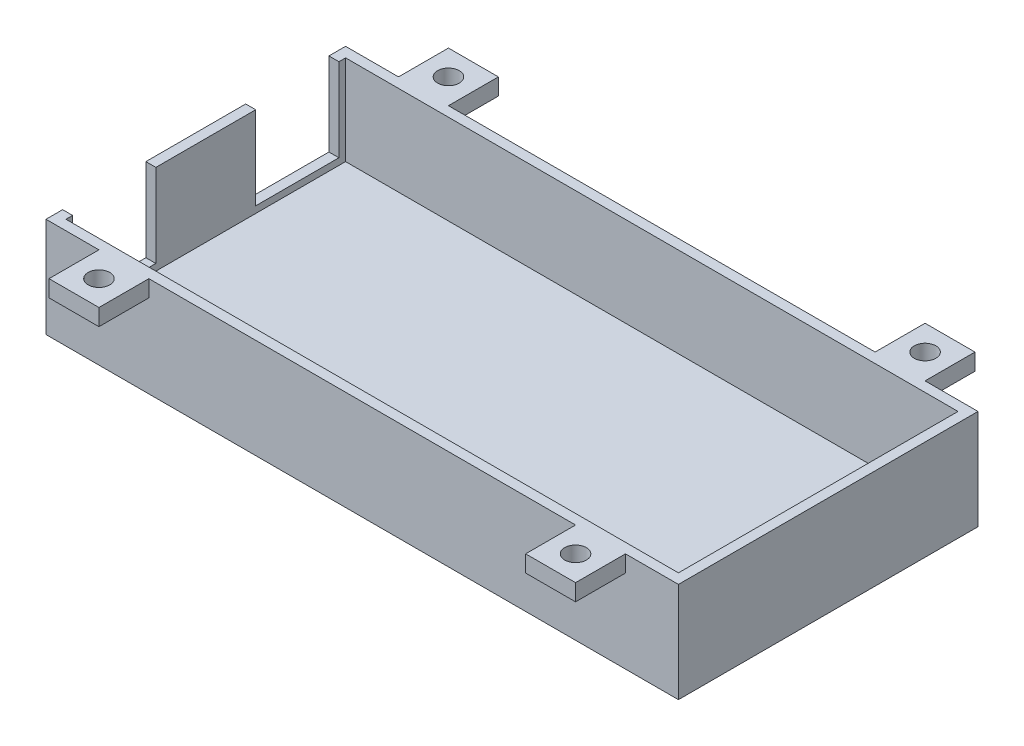
ISO-10303-21;
HEADER;
FILE_DESCRIPTION(('STEP AP214'),'2;1');
FILE_NAME('part.step','',(''),(''),'','','');
FILE_SCHEMA(('AUTOMOTIVE_DESIGN { 1 0 10303 214 1 1 1 1 }'));
ENDSEC;
DATA;
#1=APPLICATION_CONTEXT('core data for automotive mechanical design processes');
#2=APPLICATION_PROTOCOL_DEFINITION('international standard','automotive_design',2000,#1);
#3=PRODUCT_CONTEXT('',#1,'mechanical');
#4=PRODUCT('Part','Part','',(#3));
#5=PRODUCT_RELATED_PRODUCT_CATEGORY('part','',(#4));
#6=PRODUCT_DEFINITION_FORMATION('','',#4);
#7=PRODUCT_DEFINITION_CONTEXT('part definition',#1,'design');
#8=PRODUCT_DEFINITION('design','',#6,#7);
#9=PRODUCT_DEFINITION_SHAPE('','',#8);
#10=(LENGTH_UNIT() NAMED_UNIT(*) SI_UNIT(.MILLI.,.METRE.));
#11=(NAMED_UNIT(*) PLANE_ANGLE_UNIT() SI_UNIT($,.RADIAN.));
#12=(NAMED_UNIT(*) SI_UNIT($,.STERADIAN.) SOLID_ANGLE_UNIT());
#13=UNCERTAINTY_MEASURE_WITH_UNIT(LENGTH_MEASURE(1.E-05),#10,'distance_accuracy_value','');
#14=(GEOMETRIC_REPRESENTATION_CONTEXT(3) GLOBAL_UNCERTAINTY_ASSIGNED_CONTEXT((#13)) GLOBAL_UNIT_ASSIGNED_CONTEXT((#10,
#11,#12)) REPRESENTATION_CONTEXT('',''));
#15=CARTESIAN_POINT('',(0.,0.,0.));
#16=DIRECTION('',(0.,0.,1.));
#17=DIRECTION('',(1.,0.,0.));
#18=AXIS2_PLACEMENT_3D('',#15,#16,#17);
#19=CARTESIAN_POINT('',(0.,30.,0.));
#20=DIRECTION('',(0.,1.,0.));
#21=DIRECTION('',(0.,0.,1.));
#22=AXIS2_PLACEMENT_3D('',#19,#20,#21);
#23=PLANE('',#22);
#24=CARTESIAN_POINT('',(-71.5935450431154,30.,-52.5));
#25=DIRECTION('',(0.,1.,0.));
#26=DIRECTION('',(0.,0.,1.));
#27=AXIS2_PLACEMENT_3D('',#24,#25,#26);
#28=CIRCLE('',#27,3.25000000000001);
#29=CARTESIAN_POINT('',(-71.5935450431154,30.,-49.25));
#30=VERTEX_POINT('',#29);
#31=EDGE_CURVE('E393',#30,#30,#28,.T.);
#32=ORIENTED_EDGE('',*,*,#31,.F.);
#33=EDGE_LOOP('',(#32));
#34=FACE_BOUND('',#33,.T.);
#35=CARTESIAN_POINT('',(-71.5935450431154,30.,52.5));
#36=DIRECTION('',(0.,1.,0.));
#37=DIRECTION('',(0.,0.,-1.));
#38=AXIS2_PLACEMENT_3D('',#35,#36,#37);
#39=CIRCLE('',#38,3.25000000000001);
#40=CARTESIAN_POINT('',(-71.5935450431154,30.,49.25));
#41=VERTEX_POINT('',#40);
#42=EDGE_CURVE('E357',#41,#41,#39,.T.);
#43=ORIENTED_EDGE('',*,*,#42,.F.);
#44=EDGE_LOOP('',(#43));
#45=FACE_BOUND('',#44,.T.);
#46=CARTESIAN_POINT('',(71.5935450431154,30.,52.5));
#47=DIRECTION('',(0.,1.,0.));
#48=DIRECTION('',(0.,0.,1.));
#49=AXIS2_PLACEMENT_3D('',#46,#47,#48);
#50=CIRCLE('',#49,3.25000000000001);
#51=CARTESIAN_POINT('',(71.5935450431154,30.,55.75));
#52=VERTEX_POINT('',#51);
#53=EDGE_CURVE('E322',#52,#52,#50,.T.);
#54=ORIENTED_EDGE('',*,*,#53,.F.);
#55=EDGE_LOOP('',(#54));
#56=FACE_BOUND('',#55,.T.);
#57=CARTESIAN_POINT('',(71.5935450431154,30.,-52.5));
#58=DIRECTION('',(0.,1.,0.));
#59=DIRECTION('',(0.,0.,-1.));
#60=AXIS2_PLACEMENT_3D('',#57,#58,#59);
#61=CIRCLE('',#60,3.25000000000001);
#62=CARTESIAN_POINT('',(71.5935450431154,30.,-55.75));
#63=VERTEX_POINT('',#62);
#64=EDGE_CURVE('E295',#63,#63,#61,.T.);
#65=ORIENTED_EDGE('',*,*,#64,.F.);
#66=EDGE_LOOP('',(#65));
#67=FACE_BOUND('',#66,.T.);
#68=DIRECTION('',(-1.,0.,0.));
#69=VECTOR('',#68,1.);
#70=CARTESIAN_POINT('',(92.,30.,42.));
#71=LINE('',#70,#69);
#72=CARTESIAN_POINT('',(92.,30.,42.));
#73=VERTEX_POINT('',#72);
#74=CARTESIAN_POINT('',(-92.,30.,42.));
#75=VERTEX_POINT('',#74);
#76=EDGE_CURVE('E265',#73,#75,#71,.T.);
#77=ORIENTED_EDGE('',*,*,#76,.T.);
#78=DIRECTION('',(0.,0.,-1.));
#79=VECTOR('',#78,1.);
#80=CARTESIAN_POINT('',(-92.,30.,42.));
#81=LINE('',#80,#79);
#82=CARTESIAN_POINT('',(-92.,30.,40.));
#83=VERTEX_POINT('',#82);
#84=EDGE_CURVE('E268',#75,#83,#81,.T.);
#85=ORIENTED_EDGE('',*,*,#84,.T.);
#86=DIRECTION('',(1.,0.,0.));
#87=VECTOR('',#86,1.);
#88=CARTESIAN_POINT('',(-90.,30.,40.));
#89=LINE('',#88,#87);
#90=CARTESIAN_POINT('',(-95.,30.,40.));
#91=VERTEX_POINT('',#90);
#92=EDGE_CURVE('E464',#91,#83,#89,.T.);
#93=ORIENTED_EDGE('',*,*,#92,.F.);
#94=DIRECTION('',(0.,0.,1.));
#95=VECTOR('',#94,1.);
#96=CARTESIAN_POINT('',(-95.,30.,-45.));
#97=LINE('',#96,#95);
#98=CARTESIAN_POINT('',(-95.,30.,45.));
#99=VERTEX_POINT('',#98);
#100=EDGE_CURVE('E478',#91,#99,#97,.T.);
#101=ORIENTED_EDGE('',*,*,#100,.T.);
#102=DIRECTION('',(1.,0.,0.));
#103=VECTOR('',#102,1.);
#104=CARTESIAN_POINT('',(-95.,30.,45.));
#105=LINE('',#104,#103);
#106=CARTESIAN_POINT('',(-79.0935450431154,30.,45.));
#107=VERTEX_POINT('',#106);
#108=EDGE_CURVE('E485',#99,#107,#105,.T.);
#109=ORIENTED_EDGE('',*,*,#108,.T.);
#110=DIRECTION('',(0.,0.,1.));
#111=VECTOR('',#110,1.);
#112=CARTESIAN_POINT('',(-79.0935450431154,30.,45.));
#113=LINE('',#112,#111);
#114=CARTESIAN_POINT('',(-79.0935450431154,30.,60.));
#115=VERTEX_POINT('',#114);
#116=EDGE_CURVE('E367',#107,#115,#113,.T.);
#117=ORIENTED_EDGE('',*,*,#116,.T.);
#118=DIRECTION('',(1.,0.,0.));
#119=VECTOR('',#118,1.);
#120=CARTESIAN_POINT('',(-79.0935450431154,30.,60.));
#121=LINE('',#120,#119);
#122=CARTESIAN_POINT('',(-64.0935450431154,30.,60.));
#123=VERTEX_POINT('',#122);
#124=EDGE_CURVE('E385',#115,#123,#121,.T.);
#125=ORIENTED_EDGE('',*,*,#124,.T.);
#126=DIRECTION('',(0.,0.,-1.));
#127=VECTOR('',#126,1.);
#128=CARTESIAN_POINT('',(-64.0935450431154,30.,45.));
#129=LINE('',#128,#127);
#130=CARTESIAN_POINT('',(-64.0935450431154,30.,45.));
#131=VERTEX_POINT('',#130);
#132=EDGE_CURVE('E374',#123,#131,#129,.T.);
#133=ORIENTED_EDGE('',*,*,#132,.T.);
#134=CARTESIAN_POINT('',(64.0935450431154,30.,45.));
#135=VERTEX_POINT('',#134);
#136=EDGE_CURVE('E489',#131,#135,#105,.T.);
#137=ORIENTED_EDGE('',*,*,#136,.T.);
#138=DIRECTION('',(0.,0.,1.));
#139=VECTOR('',#138,1.);
#140=CARTESIAN_POINT('',(64.0935450431154,30.,45.));
#141=LINE('',#140,#139);
#142=CARTESIAN_POINT('',(64.0935450431154,30.,60.));
#143=VERTEX_POINT('',#142);
#144=EDGE_CURVE('E331',#135,#143,#141,.T.);
#145=ORIENTED_EDGE('',*,*,#144,.T.);
#146=DIRECTION('',(1.,0.,0.));
#147=VECTOR('',#146,1.);
#148=CARTESIAN_POINT('',(79.0935450431154,30.,60.));
#149=LINE('',#148,#147);
#150=CARTESIAN_POINT('',(79.0935450431154,30.,60.));
#151=VERTEX_POINT('',#150);
#152=EDGE_CURVE('E350',#143,#151,#149,.T.);
#153=ORIENTED_EDGE('',*,*,#152,.T.);
#154=DIRECTION('',(0.,0.,-1.));
#155=VECTOR('',#154,1.);
#156=CARTESIAN_POINT('',(79.0935450431154,30.,45.));
#157=LINE('',#156,#155);
#158=CARTESIAN_POINT('',(79.0935450431154,30.,45.));
#159=VERTEX_POINT('',#158);
#160=EDGE_CURVE('E338',#151,#159,#157,.T.);
#161=ORIENTED_EDGE('',*,*,#160,.T.);
#162=CARTESIAN_POINT('',(95.,30.,45.));
#163=VERTEX_POINT('',#162);
#164=EDGE_CURVE('E483',#159,#163,#105,.T.);
#165=ORIENTED_EDGE('',*,*,#164,.T.);
#166=DIRECTION('',(0.,0.,-1.));
#167=VECTOR('',#166,1.);
#168=CARTESIAN_POINT('',(95.,30.,-45.));
#169=LINE('',#168,#167);
#170=CARTESIAN_POINT('',(95.,30.,-45.));
#171=VERTEX_POINT('',#170);
#172=EDGE_CURVE('E468',#163,#171,#169,.T.);
#173=ORIENTED_EDGE('',*,*,#172,.T.);
#174=DIRECTION('',(-1.,0.,0.));
#175=VECTOR('',#174,1.);
#176=CARTESIAN_POINT('',(-95.,30.,-45.));
#177=LINE('',#176,#175);
#178=CARTESIAN_POINT('',(79.0935450431154,30.,-45.));
#179=VERTEX_POINT('',#178);
#180=EDGE_CURVE('E475',#171,#179,#177,.T.);
#181=ORIENTED_EDGE('',*,*,#180,.T.);
#182=DIRECTION('',(0.,0.,-1.));
#183=VECTOR('',#182,1.);
#184=CARTESIAN_POINT('',(79.0935450431154,30.,-45.));
#185=LINE('',#184,#183);
#186=CARTESIAN_POINT('',(79.0935450431154,30.,-60.));
#187=VERTEX_POINT('',#186);
#188=EDGE_CURVE('E299',#179,#187,#185,.T.);
#189=ORIENTED_EDGE('',*,*,#188,.T.);
#190=DIRECTION('',(-1.,0.,0.));
#191=VECTOR('',#190,1.);
#192=CARTESIAN_POINT('',(79.0935450431154,30.,-60.));
#193=LINE('',#192,#191);
#194=CARTESIAN_POINT('',(64.0935450431154,30.,-60.));
#195=VERTEX_POINT('',#194);
#196=EDGE_CURVE('E316',#187,#195,#193,.T.);
#197=ORIENTED_EDGE('',*,*,#196,.T.);
#198=DIRECTION('',(0.,0.,1.));
#199=VECTOR('',#198,1.);
#200=CARTESIAN_POINT('',(64.0935450431154,30.,-45.));
#201=LINE('',#200,#199);
#202=CARTESIAN_POINT('',(64.0935450431154,30.,-45.));
#203=VERTEX_POINT('',#202);
#204=EDGE_CURVE('E55',#195,#203,#201,.T.);
#205=ORIENTED_EDGE('',*,*,#204,.T.);
#206=CARTESIAN_POINT('',(-64.0935450431154,30.,-45.));
#207=VERTEX_POINT('',#206);
#208=EDGE_CURVE('E479',#203,#207,#177,.T.);
#209=ORIENTED_EDGE('',*,*,#208,.T.);
#210=DIRECTION('',(0.,0.,-1.));
#211=VECTOR('',#210,1.);
#212=CARTESIAN_POINT('',(-64.0935450431154,30.,-45.));
#213=LINE('',#212,#211);
#214=CARTESIAN_POINT('',(-64.0935450431154,30.,-60.));
#215=VERTEX_POINT('',#214);
#216=EDGE_CURVE('E421',#207,#215,#213,.T.);
#217=ORIENTED_EDGE('',*,*,#216,.T.);
#218=DIRECTION('',(-1.,0.,0.));
#219=VECTOR('',#218,1.);
#220=CARTESIAN_POINT('',(-79.0935450431154,30.,-60.));
#221=LINE('',#220,#219);
#222=CARTESIAN_POINT('',(-79.0935450431154,30.,-60.));
#223=VERTEX_POINT('',#222);
#224=EDGE_CURVE('E409',#215,#223,#221,.T.);
#225=ORIENTED_EDGE('',*,*,#224,.T.);
#226=DIRECTION('',(0.,0.,1.));
#227=VECTOR('',#226,1.);
#228=CARTESIAN_POINT('',(-79.0935450431154,30.,-45.));
#229=LINE('',#228,#227);
#230=CARTESIAN_POINT('',(-79.0935450431154,30.,-45.));
#231=VERTEX_POINT('',#230);
#232=EDGE_CURVE('E402',#223,#231,#229,.T.);
#233=ORIENTED_EDGE('',*,*,#232,.T.);
#234=CARTESIAN_POINT('',(-95.,30.,-45.));
#235=VERTEX_POINT('',#234);
#236=EDGE_CURVE('E474',#231,#235,#177,.T.);
#237=ORIENTED_EDGE('',*,*,#236,.T.);
#238=CARTESIAN_POINT('',(-95.,30.,-40.));
#239=VERTEX_POINT('',#238);
#240=EDGE_CURVE('E480',#235,#239,#97,.T.);
#241=ORIENTED_EDGE('',*,*,#240,.T.);
#242=DIRECTION('',(-1.,0.,0.));
#243=VECTOR('',#242,1.);
#244=CARTESIAN_POINT('',(-90.,30.,-40.));
#245=LINE('',#244,#243);
#246=CARTESIAN_POINT('',(-92.,30.,-40.));
#247=VERTEX_POINT('',#246);
#248=EDGE_CURVE('E462',#247,#239,#245,.T.);
#249=ORIENTED_EDGE('',*,*,#248,.F.);
#250=CARTESIAN_POINT('',(-92.,30.,-42.));
#251=VERTEX_POINT('',#250);
#252=EDGE_CURVE('E276',#247,#251,#81,.T.);
#253=ORIENTED_EDGE('',*,*,#252,.T.);
#254=DIRECTION('',(-1.,0.,0.));
#255=VECTOR('',#254,1.);
#256=CARTESIAN_POINT('',(92.,30.,-42.));
#257=LINE('',#256,#255);
#258=CARTESIAN_POINT('',(92.,30.,-42.));
#259=VERTEX_POINT('',#258);
#260=EDGE_CURVE('E274',#259,#251,#257,.T.);
#261=ORIENTED_EDGE('',*,*,#260,.F.);
#262=DIRECTION('',(0.,0.,-1.));
#263=VECTOR('',#262,1.);
#264=CARTESIAN_POINT('',(92.,30.,42.));
#265=LINE('',#264,#263);
#266=EDGE_CURVE('E248',#73,#259,#265,.T.);
#267=ORIENTED_EDGE('',*,*,#266,.F.);
#268=EDGE_LOOP('',(#77,#85,#93,#101,#109,#117,#125,#133,#137,#145,#153,#161,#165,#173,#181,#189,
#197,#205,#209,#217,#225,#233,#237,#241,#249,#253,#261,#267));
#269=FACE_BOUND('',#268,.T.);
#270=ADVANCED_FACE('F33',(#34,#45,#56,#67,#269),#23,.T.);
#271=DIRECTION('',(1.,0.,0.));
#272=VECTOR('',#271,1.);
#273=CARTESIAN_POINT('',(-130.355339059327,30.,15.));
#274=LINE('',#273,#272);
#275=CARTESIAN_POINT('',(-95.,30.,15.));
#276=VERTEX_POINT('',#275);
#277=CARTESIAN_POINT('',(-92.,30.,15.));
#278=VERTEX_POINT('',#277);
#279=EDGE_CURVE('E454',#276,#278,#274,.T.);
#280=ORIENTED_EDGE('',*,*,#279,.T.);
#281=CARTESIAN_POINT('',(-92.,30.,-15.));
#282=VERTEX_POINT('',#281);
#283=EDGE_CURVE('E278',#278,#282,#81,.T.);
#284=ORIENTED_EDGE('',*,*,#283,.T.);
#285=DIRECTION('',(1.,0.,0.));
#286=VECTOR('',#285,1.);
#287=CARTESIAN_POINT('',(-130.355339059327,30.,-15.));
#288=LINE('',#287,#286);
#289=CARTESIAN_POINT('',(-95.,30.,-15.));
#290=VERTEX_POINT('',#289);
#291=EDGE_CURVE('E444',#290,#282,#288,.T.);
#292=ORIENTED_EDGE('',*,*,#291,.F.);
#293=EDGE_CURVE('E484',#290,#276,#97,.T.);
#294=ORIENTED_EDGE('',*,*,#293,.T.);
#295=EDGE_LOOP('',(#280,#284,#292,#294));
#296=FACE_BOUND('',#295,.T.);
#297=ADVANCED_FACE('F534',(#296),#23,.T.);
#298=CARTESIAN_POINT('',(-90.,30.,-40.));
#299=DIRECTION('',(0.,0.,1.));
#300=DIRECTION('',(1.,0.,0.));
#301=AXIS2_PLACEMENT_3D('',#298,#299,#300);
#302=PLANE('',#301);
#303=DIRECTION('',(-1.,0.,0.));
#304=VECTOR('',#303,1.);
#305=CARTESIAN_POINT('',(-90.,5.,-40.));
#306=LINE('',#305,#304);
#307=CARTESIAN_POINT('',(-92.,5.,-40.));
#308=VERTEX_POINT('',#307);
#309=CARTESIAN_POINT('',(-95.,5.,-40.));
#310=VERTEX_POINT('',#309);
#311=EDGE_CURVE('E449',#308,#310,#306,.T.);
#312=ORIENTED_EDGE('',*,*,#311,.F.);
#313=DIRECTION('',(0.,1.,0.));
#314=VECTOR('',#313,1.);
#315=CARTESIAN_POINT('',(-92.,30.,-40.));
#316=LINE('',#315,#314);
#317=EDGE_CURVE('E286',#308,#247,#316,.T.);
#318=ORIENTED_EDGE('',*,*,#317,.T.);
#319=ORIENTED_EDGE('',*,*,#248,.T.);
#320=DIRECTION('',(0.,-1.,0.));
#321=VECTOR('',#320,1.);
#322=CARTESIAN_POINT('',(-95.,5.,-40.));
#323=LINE('',#322,#321);
#324=EDGE_CURVE('E437',#239,#310,#323,.T.);
#325=ORIENTED_EDGE('',*,*,#324,.T.);
#326=EDGE_LOOP('',(#312,#318,#319,#325));
#327=FACE_BOUND('',#326,.T.);
#328=ADVANCED_FACE('F551',(#327),#302,.T.);
#329=CARTESIAN_POINT('',(-90.,30.,40.));
#330=DIRECTION('',(0.,0.,-1.));
#331=DIRECTION('',(-1.,0.,0.));
#332=AXIS2_PLACEMENT_3D('',#329,#330,#331);
#333=PLANE('',#332);
#334=ORIENTED_EDGE('',*,*,#92,.T.);
#335=DIRECTION('',(0.,-1.,0.));
#336=VECTOR('',#335,1.);
#337=CARTESIAN_POINT('',(-92.,30.,40.));
#338=LINE('',#337,#336);
#339=CARTESIAN_POINT('',(-92.,5.,40.));
#340=VERTEX_POINT('',#339);
#341=EDGE_CURVE('E292',#83,#340,#338,.T.);
#342=ORIENTED_EDGE('',*,*,#341,.T.);
#343=DIRECTION('',(1.,0.,0.));
#344=VECTOR('',#343,1.);
#345=CARTESIAN_POINT('',(-90.,5.,40.));
#346=LINE('',#345,#344);
#347=CARTESIAN_POINT('',(-95.,5.,40.));
#348=VERTEX_POINT('',#347);
#349=EDGE_CURVE('E465',#348,#340,#346,.T.);
#350=ORIENTED_EDGE('',*,*,#349,.F.);
#351=DIRECTION('',(0.,1.,0.));
#352=VECTOR('',#351,1.);
#353=CARTESIAN_POINT('',(-95.,30.,40.));
#354=LINE('',#353,#352);
#355=EDGE_CURVE('E450',#348,#91,#354,.T.);
#356=ORIENTED_EDGE('',*,*,#355,.T.);
#357=EDGE_LOOP('',(#334,#342,#350,#356));
#358=FACE_BOUND('',#357,.T.);
#359=ADVANCED_FACE('F549',(#358),#333,.T.);
#360=CARTESIAN_POINT('',(0.,5.,0.));
#361=DIRECTION('',(0.,1.,0.));
#362=DIRECTION('',(0.,0.,1.));
#363=AXIS2_PLACEMENT_3D('',#360,#361,#362);
#364=PLANE('',#363);
#365=ORIENTED_EDGE('',*,*,#349,.T.);
#366=DIRECTION('',(0.,0.,-1.));
#367=VECTOR('',#366,1.);
#368=CARTESIAN_POINT('',(-92.,5.,0.));
#369=LINE('',#368,#367);
#370=CARTESIAN_POINT('',(-92.,5.,15.));
#371=VERTEX_POINT('',#370);
#372=EDGE_CURVE('E287',#340,#371,#369,.T.);
#373=ORIENTED_EDGE('',*,*,#372,.T.);
#374=DIRECTION('',(1.,0.,0.));
#375=VECTOR('',#374,1.);
#376=CARTESIAN_POINT('',(-130.355339059327,5.,15.));
#377=LINE('',#376,#375);
#378=CARTESIAN_POINT('',(-95.,5.,15.));
#379=VERTEX_POINT('',#378);
#380=EDGE_CURVE('E428',#379,#371,#377,.T.);
#381=ORIENTED_EDGE('',*,*,#380,.F.);
#382=DIRECTION('',(0.,0.,1.));
#383=VECTOR('',#382,1.);
#384=CARTESIAN_POINT('',(-95.,5.,40.));
#385=LINE('',#384,#383);
#386=EDGE_CURVE('E453',#379,#348,#385,.T.);
#387=ORIENTED_EDGE('',*,*,#386,.T.);
#388=EDGE_LOOP('',(#365,#373,#381,#387));
#389=FACE_BOUND('',#388,.T.);
#390=ADVANCED_FACE('F545',(#389),#364,.T.);
#391=DIRECTION('',(1.,0.,0.));
#392=VECTOR('',#391,1.);
#393=CARTESIAN_POINT('',(-130.355339059327,5.,-15.));
#394=LINE('',#393,#392);
#395=CARTESIAN_POINT('',(-95.,5.,-15.));
#396=VERTEX_POINT('',#395);
#397=CARTESIAN_POINT('',(-92.,5.,-15.));
#398=VERTEX_POINT('',#397);
#399=EDGE_CURVE('E438',#396,#398,#394,.T.);
#400=ORIENTED_EDGE('',*,*,#399,.T.);
#401=EDGE_CURVE('E47',#398,#308,#369,.T.);
#402=ORIENTED_EDGE('',*,*,#401,.T.);
#403=ORIENTED_EDGE('',*,*,#311,.T.);
#404=DIRECTION('',(0.,0.,1.));
#405=VECTOR('',#404,1.);
#406=CARTESIAN_POINT('',(-95.,5.,-15.));
#407=LINE('',#406,#405);
#408=EDGE_CURVE('E435',#310,#396,#407,.T.);
#409=ORIENTED_EDGE('',*,*,#408,.T.);
#410=EDGE_LOOP('',(#400,#402,#403,#409));
#411=FACE_BOUND('',#410,.T.);
#412=ADVANCED_FACE('F557',(#411),#364,.T.);
#413=CARTESIAN_POINT('',(-130.355339059327,5.,15.));
#414=DIRECTION('',(0.,0.,-1.));
#415=DIRECTION('',(-1.,0.,0.));
#416=AXIS2_PLACEMENT_3D('',#413,#414,#415);
#417=PLANE('',#416);
#418=DIRECTION('',(0.,-1.,0.));
#419=VECTOR('',#418,1.);
#420=CARTESIAN_POINT('',(-92.,5.,15.));
#421=LINE('',#420,#419);
#422=EDGE_CURVE('E290',#278,#371,#421,.T.);
#423=ORIENTED_EDGE('',*,*,#422,.F.);
#424=ORIENTED_EDGE('',*,*,#279,.F.);
#425=DIRECTION('',(0.,-1.,0.));
#426=VECTOR('',#425,1.);
#427=CARTESIAN_POINT('',(-95.,5.,15.));
#428=LINE('',#427,#426);
#429=EDGE_CURVE('E447',#276,#379,#428,.T.);
#430=ORIENTED_EDGE('',*,*,#429,.T.);
#431=ORIENTED_EDGE('',*,*,#380,.T.);
#432=EDGE_LOOP('',(#423,#424,#430,#431));
#433=FACE_BOUND('',#432,.T.);
#434=ADVANCED_FACE('F542',(#433),#417,.F.);
#435=CARTESIAN_POINT('',(-130.355339059327,5.,-15.));
#436=DIRECTION('',(0.,0.,1.));
#437=DIRECTION('',(1.,0.,0.));
#438=AXIS2_PLACEMENT_3D('',#435,#436,#437);
#439=PLANE('',#438);
#440=DIRECTION('',(0.,1.,0.));
#441=VECTOR('',#440,1.);
#442=CARTESIAN_POINT('',(-92.,5.,-15.));
#443=LINE('',#442,#441);
#444=EDGE_CURVE('E11',#398,#282,#443,.T.);
#445=ORIENTED_EDGE('',*,*,#444,.F.);
#446=ORIENTED_EDGE('',*,*,#399,.F.);
#447=DIRECTION('',(0.,1.,0.));
#448=VECTOR('',#447,1.);
#449=CARTESIAN_POINT('',(-95.,5.,-15.));
#450=LINE('',#449,#448);
#451=EDGE_CURVE('E441',#396,#290,#450,.T.);
#452=ORIENTED_EDGE('',*,*,#451,.T.);
#453=ORIENTED_EDGE('',*,*,#291,.T.);
#454=EDGE_LOOP('',(#445,#446,#452,#453));
#455=FACE_BOUND('',#454,.T.);
#456=ADVANCED_FACE('F577',(#455),#439,.F.);
#457=CARTESIAN_POINT('',(-95.,5.,45.));
#458=DIRECTION('',(0.,0.,-1.));
#459=DIRECTION('',(-1.,0.,0.));
#460=AXIS2_PLACEMENT_3D('',#457,#458,#459);
#461=PLANE('',#460);
#462=ORIENTED_EDGE('',*,*,#164,.F.);
#463=DIRECTION('',(0.,1.,0.));
#464=VECTOR('',#463,1.);
#465=CARTESIAN_POINT('',(79.0935450431154,25.,45.));
#466=LINE('',#465,#464);
#467=CARTESIAN_POINT('',(79.0935450431154,25.,45.));
#468=VERTEX_POINT('',#467);
#469=EDGE_CURVE('E354',#468,#159,#466,.T.);
#470=ORIENTED_EDGE('',*,*,#469,.F.);
#471=DIRECTION('',(-1.,0.,0.));
#472=VECTOR('',#471,1.);
#473=CARTESIAN_POINT('',(79.0935450431154,25.,45.));
#474=LINE('',#473,#472);
#475=CARTESIAN_POINT('',(64.0935450431154,25.,45.));
#476=VERTEX_POINT('',#475);
#477=EDGE_CURVE('E334',#468,#476,#474,.T.);
#478=ORIENTED_EDGE('',*,*,#477,.T.);
#479=DIRECTION('',(0.,1.,0.));
#480=VECTOR('',#479,1.);
#481=CARTESIAN_POINT('',(64.0935450431154,25.,45.));
#482=LINE('',#481,#480);
#483=EDGE_CURVE('E347',#476,#135,#482,.T.);
#484=ORIENTED_EDGE('',*,*,#483,.T.);
#485=ORIENTED_EDGE('',*,*,#136,.F.);
#486=DIRECTION('',(0.,1.,0.));
#487=VECTOR('',#486,1.);
#488=CARTESIAN_POINT('',(-64.0935450431154,25.,45.));
#489=LINE('',#488,#487);
#490=CARTESIAN_POINT('',(-64.0935450431154,25.,45.));
#491=VERTEX_POINT('',#490);
#492=EDGE_CURVE('E394',#491,#131,#489,.T.);
#493=ORIENTED_EDGE('',*,*,#492,.F.);
#494=DIRECTION('',(-1.,0.,0.));
#495=VECTOR('',#494,1.);
#496=CARTESIAN_POINT('',(-79.0935450431154,25.,45.));
#497=LINE('',#496,#495);
#498=CARTESIAN_POINT('',(-79.0935450431154,25.,45.));
#499=VERTEX_POINT('',#498);
#500=EDGE_CURVE('E379',#491,#499,#497,.T.);
#501=ORIENTED_EDGE('',*,*,#500,.T.);
#502=DIRECTION('',(0.,1.,0.));
#503=VECTOR('',#502,1.);
#504=CARTESIAN_POINT('',(-79.0935450431154,25.,45.));
#505=LINE('',#504,#503);
#506=EDGE_CURVE('E390',#499,#107,#505,.T.);
#507=ORIENTED_EDGE('',*,*,#506,.T.);
#508=ORIENTED_EDGE('',*,*,#108,.F.);
#509=DIRECTION('',(0.,-1.,0.));
#510=VECTOR('',#509,1.);
#511=CARTESIAN_POINT('',(-95.,5.,45.));
#512=LINE('',#511,#510);
#513=CARTESIAN_POINT('',(-95.,0.,45.));
#514=VERTEX_POINT('',#513);
#515=EDGE_CURVE('E501',#99,#514,#512,.T.);
#516=ORIENTED_EDGE('',*,*,#515,.T.);
#517=DIRECTION('',(1.,0.,0.));
#518=VECTOR('',#517,1.);
#519=CARTESIAN_POINT('',(-95.,0.,45.));
#520=LINE('',#519,#518);
#521=CARTESIAN_POINT('',(95.,0.,45.));
#522=VERTEX_POINT('',#521);
#523=EDGE_CURVE('E496',#514,#522,#520,.T.);
#524=ORIENTED_EDGE('',*,*,#523,.T.);
#525=DIRECTION('',(0.,-1.,0.));
#526=VECTOR('',#525,1.);
#527=CARTESIAN_POINT('',(95.,5.,45.));
#528=LINE('',#527,#526);
#529=EDGE_CURVE('E498',#163,#522,#528,.T.);
#530=ORIENTED_EDGE('',*,*,#529,.F.);
#531=EDGE_LOOP('',(#462,#470,#478,#484,#485,#493,#501,#507,#508,#516,#524,#530));
#532=FACE_BOUND('',#531,.T.);
#533=ADVANCED_FACE('F528',(#532),#461,.F.);
#534=CARTESIAN_POINT('',(-95.,5.,-45.));
#535=DIRECTION('',(0.,0.,1.));
#536=DIRECTION('',(1.,0.,0.));
#537=AXIS2_PLACEMENT_3D('',#534,#535,#536);
#538=PLANE('',#537);
#539=DIRECTION('',(1.,0.,0.));
#540=VECTOR('',#539,1.);
#541=CARTESIAN_POINT('',(79.0935450431154,25.,-45.));
#542=LINE('',#541,#540);
#543=CARTESIAN_POINT('',(64.0935450431154,25.,-45.));
#544=VERTEX_POINT('',#543);
#545=CARTESIAN_POINT('',(79.0935450431154,25.,-45.));
#546=VERTEX_POINT('',#545);
#547=EDGE_CURVE('E310',#544,#546,#542,.T.);
#548=ORIENTED_EDGE('',*,*,#547,.T.);
#549=DIRECTION('',(0.,1.,0.));
#550=VECTOR('',#549,1.);
#551=CARTESIAN_POINT('',(79.0935450431154,25.,-45.));
#552=LINE('',#551,#550);
#553=EDGE_CURVE('E319',#546,#179,#552,.T.);
#554=ORIENTED_EDGE('',*,*,#553,.T.);
#555=ORIENTED_EDGE('',*,*,#180,.F.);
#556=DIRECTION('',(0.,-1.,0.));
#557=VECTOR('',#556,1.);
#558=CARTESIAN_POINT('',(95.,5.,-45.));
#559=LINE('',#558,#557);
#560=CARTESIAN_POINT('',(95.,0.,-45.));
#561=VERTEX_POINT('',#560);
#562=EDGE_CURVE('E41',#171,#561,#559,.T.);
#563=ORIENTED_EDGE('',*,*,#562,.T.);
#564=DIRECTION('',(-1.,0.,0.));
#565=VECTOR('',#564,1.);
#566=CARTESIAN_POINT('',(-95.,0.,-45.));
#567=LINE('',#566,#565);
#568=CARTESIAN_POINT('',(-95.,0.,-45.));
#569=VERTEX_POINT('',#568);
#570=EDGE_CURVE('E492',#561,#569,#567,.T.);
#571=ORIENTED_EDGE('',*,*,#570,.T.);
#572=DIRECTION('',(0.,-1.,0.));
#573=VECTOR('',#572,1.);
#574=CARTESIAN_POINT('',(-95.,5.,-45.));
#575=LINE('',#574,#573);
#576=EDGE_CURVE('E504',#235,#569,#575,.T.);
#577=ORIENTED_EDGE('',*,*,#576,.F.);
#578=ORIENTED_EDGE('',*,*,#236,.F.);
#579=DIRECTION('',(0.,1.,0.));
#580=VECTOR('',#579,1.);
#581=CARTESIAN_POINT('',(-79.0935450431154,25.,-45.));
#582=LINE('',#581,#580);
#583=CARTESIAN_POINT('',(-79.0935450431154,25.,-45.));
#584=VERTEX_POINT('',#583);
#585=EDGE_CURVE('E418',#584,#231,#582,.T.);
#586=ORIENTED_EDGE('',*,*,#585,.F.);
#587=DIRECTION('',(1.,0.,0.));
#588=VECTOR('',#587,1.);
#589=CARTESIAN_POINT('',(-79.0935450431154,25.,-45.));
#590=LINE('',#589,#588);
#591=CARTESIAN_POINT('',(-64.0935450431154,25.,-45.));
#592=VERTEX_POINT('',#591);
#593=EDGE_CURVE('E408',#584,#592,#590,.T.);
#594=ORIENTED_EDGE('',*,*,#593,.T.);
#595=DIRECTION('',(0.,1.,0.));
#596=VECTOR('',#595,1.);
#597=CARTESIAN_POINT('',(-64.0935450431154,25.,-45.));
#598=LINE('',#597,#596);
#599=EDGE_CURVE('E431',#592,#207,#598,.T.);
#600=ORIENTED_EDGE('',*,*,#599,.T.);
#601=ORIENTED_EDGE('',*,*,#208,.F.);
#602=DIRECTION('',(0.,1.,0.));
#603=VECTOR('',#602,1.);
#604=CARTESIAN_POINT('',(64.0935450431154,25.,-45.));
#605=LINE('',#604,#603);
#606=EDGE_CURVE('E323',#544,#203,#605,.T.);
#607=ORIENTED_EDGE('',*,*,#606,.F.);
#608=EDGE_LOOP('',(#548,#554,#555,#563,#571,#577,#578,#586,#594,#600,#601,#607));
#609=FACE_BOUND('',#608,.T.);
#610=ADVANCED_FACE('F509',(#609),#538,.F.);
#611=CARTESIAN_POINT('',(95.,5.,-45.));
#612=DIRECTION('',(-1.,0.,0.));
#613=DIRECTION('',(0.,0.,1.));
#614=AXIS2_PLACEMENT_3D('',#611,#612,#613);
#615=PLANE('',#614);
#616=DIRECTION('',(0.,0.,-1.));
#617=VECTOR('',#616,1.);
#618=CARTESIAN_POINT('',(95.,0.,-45.));
#619=LINE('',#618,#617);
#620=EDGE_CURVE('E488',#522,#561,#619,.T.);
#621=ORIENTED_EDGE('',*,*,#620,.T.);
#622=ORIENTED_EDGE('',*,*,#562,.F.);
#623=ORIENTED_EDGE('',*,*,#172,.F.);
#624=ORIENTED_EDGE('',*,*,#529,.T.);
#625=EDGE_LOOP('',(#621,#622,#623,#624));
#626=FACE_BOUND('',#625,.T.);
#627=ADVANCED_FACE('F35',(#626),#615,.F.);
#628=CARTESIAN_POINT('',(-95.,5.,-45.));
#629=DIRECTION('',(1.,0.,0.));
#630=DIRECTION('',(0.,0.,-1.));
#631=AXIS2_PLACEMENT_3D('',#628,#629,#630);
#632=PLANE('',#631);
#633=ORIENTED_EDGE('',*,*,#408,.F.);
#634=ORIENTED_EDGE('',*,*,#324,.F.);
#635=ORIENTED_EDGE('',*,*,#240,.F.);
#636=ORIENTED_EDGE('',*,*,#576,.T.);
#637=DIRECTION('',(0.,0.,1.));
#638=VECTOR('',#637,1.);
#639=CARTESIAN_POINT('',(-95.,0.,-45.));
#640=LINE('',#639,#638);
#641=EDGE_CURVE('E494',#569,#514,#640,.T.);
#642=ORIENTED_EDGE('',*,*,#641,.T.);
#643=ORIENTED_EDGE('',*,*,#515,.F.);
#644=ORIENTED_EDGE('',*,*,#100,.F.);
#645=ORIENTED_EDGE('',*,*,#355,.F.);
#646=ORIENTED_EDGE('',*,*,#386,.F.);
#647=ORIENTED_EDGE('',*,*,#429,.F.);
#648=ORIENTED_EDGE('',*,*,#293,.F.);
#649=ORIENTED_EDGE('',*,*,#451,.F.);
#650=EDGE_LOOP('',(#633,#634,#635,#636,#642,#643,#644,#645,#646,#647,#648,#649));
#651=FACE_BOUND('',#650,.T.);
#652=ADVANCED_FACE('F522',(#651),#632,.F.);
#653=CARTESIAN_POINT('',(0.,0.,0.));
#654=DIRECTION('',(0.,1.,0.));
#655=DIRECTION('',(0.,0.,1.));
#656=AXIS2_PLACEMENT_3D('',#653,#654,#655);
#657=PLANE('',#656);
#658=ORIENTED_EDGE('',*,*,#620,.F.);
#659=ORIENTED_EDGE('',*,*,#523,.F.);
#660=ORIENTED_EDGE('',*,*,#641,.F.);
#661=ORIENTED_EDGE('',*,*,#570,.F.);
#662=EDGE_LOOP('',(#658,#659,#660,#661));
#663=FACE_BOUND('',#662,.T.);
#664=ADVANCED_FACE('F517',(#663),#657,.F.);
#665=CARTESIAN_POINT('',(-79.0935450431154,25.,-45.));
#666=DIRECTION('',(-1.,0.,0.));
#667=DIRECTION('',(0.,0.,1.));
#668=AXIS2_PLACEMENT_3D('',#665,#666,#667);
#669=PLANE('',#668);
#670=ORIENTED_EDGE('',*,*,#232,.F.);
#671=DIRECTION('',(0.,1.,0.));
#672=VECTOR('',#671,1.);
#673=CARTESIAN_POINT('',(-79.0935450431154,25.,-60.));
#674=LINE('',#673,#672);
#675=CARTESIAN_POINT('',(-79.0935450431154,25.,-60.));
#676=VERTEX_POINT('',#675);
#677=EDGE_CURVE('E426',#676,#223,#674,.T.);
#678=ORIENTED_EDGE('',*,*,#677,.F.);
#679=DIRECTION('',(0.,0.,1.));
#680=VECTOR('',#679,1.);
#681=CARTESIAN_POINT('',(-79.0935450431154,25.,-45.));
#682=LINE('',#681,#680);
#683=EDGE_CURVE('E405',#676,#584,#682,.T.);
#684=ORIENTED_EDGE('',*,*,#683,.T.);
#685=ORIENTED_EDGE('',*,*,#585,.T.);
#686=EDGE_LOOP('',(#670,#678,#684,#685));
#687=FACE_BOUND('',#686,.T.);
#688=ADVANCED_FACE('F574',(#687),#669,.T.);
#689=CARTESIAN_POINT('',(-79.0935450431154,25.,-60.));
#690=DIRECTION('',(0.,0.,-1.));
#691=DIRECTION('',(-1.,0.,0.));
#692=AXIS2_PLACEMENT_3D('',#689,#690,#691);
#693=PLANE('',#692);
#694=ORIENTED_EDGE('',*,*,#224,.F.);
#695=DIRECTION('',(0.,1.,0.));
#696=VECTOR('',#695,1.);
#697=CARTESIAN_POINT('',(-64.0935450431154,25.,-60.));
#698=LINE('',#697,#696);
#699=CARTESIAN_POINT('',(-64.0935450431154,25.,-60.));
#700=VERTEX_POINT('',#699);
#701=EDGE_CURVE('E429',#700,#215,#698,.T.);
#702=ORIENTED_EDGE('',*,*,#701,.F.);
#703=DIRECTION('',(-1.,0.,0.));
#704=VECTOR('',#703,1.);
#705=CARTESIAN_POINT('',(-79.0935450431154,25.,-60.));
#706=LINE('',#705,#704);
#707=EDGE_CURVE('E415',#700,#676,#706,.T.);
#708=ORIENTED_EDGE('',*,*,#707,.T.);
#709=ORIENTED_EDGE('',*,*,#677,.T.);
#710=EDGE_LOOP('',(#694,#702,#708,#709));
#711=FACE_BOUND('',#710,.T.);
#712=ADVANCED_FACE('F600',(#711),#693,.T.);
#713=CARTESIAN_POINT('',(-64.0935450431154,25.,-45.));
#714=DIRECTION('',(1.,0.,0.));
#715=DIRECTION('',(0.,0.,-1.));
#716=AXIS2_PLACEMENT_3D('',#713,#714,#715);
#717=PLANE('',#716);
#718=ORIENTED_EDGE('',*,*,#216,.F.);
#719=ORIENTED_EDGE('',*,*,#599,.F.);
#720=DIRECTION('',(0.,0.,-1.));
#721=VECTOR('',#720,1.);
#722=CARTESIAN_POINT('',(-64.0935450431154,25.,-45.));
#723=LINE('',#722,#721);
#724=EDGE_CURVE('E412',#592,#700,#723,.T.);
#725=ORIENTED_EDGE('',*,*,#724,.T.);
#726=ORIENTED_EDGE('',*,*,#701,.T.);
#727=EDGE_LOOP('',(#718,#719,#725,#726));
#728=FACE_BOUND('',#727,.T.);
#729=ADVANCED_FACE('F608',(#728),#717,.T.);
#730=CARTESIAN_POINT('',(0.,25.,0.));
#731=DIRECTION('',(0.,-1.,0.));
#732=DIRECTION('',(0.,0.,-1.));
#733=AXIS2_PLACEMENT_3D('',#730,#731,#732);
#734=PLANE('',#733);
#735=CARTESIAN_POINT('',(-71.5935450431154,25.,-52.5));
#736=DIRECTION('',(0.,1.,0.));
#737=DIRECTION('',(0.,0.,1.));
#738=AXIS2_PLACEMENT_3D('',#735,#736,#737);
#739=CIRCLE('',#738,3.25000000000001);
#740=CARTESIAN_POINT('',(-71.5935450431154,25.,-49.25));
#741=VERTEX_POINT('',#740);
#742=EDGE_CURVE('E399',#741,#741,#739,.T.);
#743=ORIENTED_EDGE('',*,*,#742,.T.);
#744=EDGE_LOOP('',(#743));
#745=FACE_BOUND('',#744,.T.);
#746=ORIENTED_EDGE('',*,*,#683,.F.);
#747=ORIENTED_EDGE('',*,*,#707,.F.);
#748=ORIENTED_EDGE('',*,*,#724,.F.);
#749=ORIENTED_EDGE('',*,*,#593,.F.);
#750=EDGE_LOOP('',(#746,#747,#748,#749));
#751=FACE_BOUND('',#750,.T.);
#752=ADVANCED_FACE('F616',(#745,#751),#734,.T.);
#753=CARTESIAN_POINT('',(-71.5935450431154,25.,-52.5));
#754=DIRECTION('',(0.,1.,0.));
#755=DIRECTION('',(0.,0.,1.));
#756=AXIS2_PLACEMENT_3D('',#753,#754,#755);
#757=CYLINDRICAL_SURFACE('',#756,3.25000000000001);
#758=ORIENTED_EDGE('',*,*,#742,.F.);
#759=EDGE_LOOP('',(#758));
#760=FACE_BOUND('',#759,.T.);
#761=ORIENTED_EDGE('',*,*,#31,.T.);
#762=EDGE_LOOP('',(#761));
#763=FACE_BOUND('',#762,.T.);
#764=ADVANCED_FACE('F624',(#760,#763),#757,.F.);
#765=CARTESIAN_POINT('',(-79.0935450431154,25.,45.));
#766=DIRECTION('',(-1.,0.,0.));
#767=DIRECTION('',(0.,0.,1.));
#768=AXIS2_PLACEMENT_3D('',#765,#766,#767);
#769=PLANE('',#768);
#770=ORIENTED_EDGE('',*,*,#116,.F.);
#771=ORIENTED_EDGE('',*,*,#506,.F.);
#772=DIRECTION('',(0.,0.,1.));
#773=VECTOR('',#772,1.);
#774=CARTESIAN_POINT('',(-79.0935450431154,25.,45.));
#775=LINE('',#774,#773);
#776=CARTESIAN_POINT('',(-79.0935450431154,25.,60.));
#777=VERTEX_POINT('',#776);
#778=EDGE_CURVE('E370',#499,#777,#775,.T.);
#779=ORIENTED_EDGE('',*,*,#778,.T.);
#780=DIRECTION('',(0.,1.,0.));
#781=VECTOR('',#780,1.);
#782=CARTESIAN_POINT('',(-79.0935450431154,25.,60.));
#783=LINE('',#782,#781);
#784=EDGE_CURVE('E382',#777,#115,#783,.T.);
#785=ORIENTED_EDGE('',*,*,#784,.T.);
#786=EDGE_LOOP('',(#770,#771,#779,#785));
#787=FACE_BOUND('',#786,.T.);
#788=ADVANCED_FACE('F632',(#787),#769,.T.);
#789=CARTESIAN_POINT('',(-64.0935450431154,25.,45.));
#790=DIRECTION('',(1.,0.,0.));
#791=DIRECTION('',(0.,0.,-1.));
#792=AXIS2_PLACEMENT_3D('',#789,#790,#791);
#793=PLANE('',#792);
#794=ORIENTED_EDGE('',*,*,#132,.F.);
#795=DIRECTION('',(0.,1.,0.));
#796=VECTOR('',#795,1.);
#797=CARTESIAN_POINT('',(-64.0935450431154,25.,60.));
#798=LINE('',#797,#796);
#799=CARTESIAN_POINT('',(-64.0935450431154,25.,60.));
#800=VERTEX_POINT('',#799);
#801=EDGE_CURVE('E396',#800,#123,#798,.T.);
#802=ORIENTED_EDGE('',*,*,#801,.F.);
#803=DIRECTION('',(0.,0.,-1.));
#804=VECTOR('',#803,1.);
#805=CARTESIAN_POINT('',(-64.0935450431154,25.,45.));
#806=LINE('',#805,#804);
#807=EDGE_CURVE('E377',#800,#491,#806,.T.);
#808=ORIENTED_EDGE('',*,*,#807,.T.);
#809=ORIENTED_EDGE('',*,*,#492,.T.);
#810=EDGE_LOOP('',(#794,#802,#808,#809));
#811=FACE_BOUND('',#810,.T.);
#812=ADVANCED_FACE('F640',(#811),#793,.T.);
#813=CARTESIAN_POINT('',(-79.0935450431154,25.,60.));
#814=DIRECTION('',(0.,0.,1.));
#815=DIRECTION('',(1.,0.,0.));
#816=AXIS2_PLACEMENT_3D('',#813,#814,#815);
#817=PLANE('',#816);
#818=ORIENTED_EDGE('',*,*,#124,.F.);
#819=ORIENTED_EDGE('',*,*,#784,.F.);
#820=DIRECTION('',(1.,0.,0.));
#821=VECTOR('',#820,1.);
#822=CARTESIAN_POINT('',(-79.0935450431154,25.,60.));
#823=LINE('',#822,#821);
#824=EDGE_CURVE('E373',#777,#800,#823,.T.);
#825=ORIENTED_EDGE('',*,*,#824,.T.);
#826=ORIENTED_EDGE('',*,*,#801,.T.);
#827=EDGE_LOOP('',(#818,#819,#825,#826));
#828=FACE_BOUND('',#827,.T.);
#829=ADVANCED_FACE('F648',(#828),#817,.T.);
#830=CARTESIAN_POINT('',(0.,25.,0.));
#831=DIRECTION('',(0.,1.,0.));
#832=DIRECTION('',(0.,0.,1.));
#833=AXIS2_PLACEMENT_3D('',#830,#831,#832);
#834=PLANE('',#833);
#835=CARTESIAN_POINT('',(-71.5935450431154,25.,52.5));
#836=DIRECTION('',(0.,1.,0.));
#837=DIRECTION('',(0.,0.,-1.));
#838=AXIS2_PLACEMENT_3D('',#835,#836,#837);
#839=CIRCLE('',#838,3.25000000000001);
#840=CARTESIAN_POINT('',(-71.5935450431154,25.,49.25));
#841=VERTEX_POINT('',#840);
#842=EDGE_CURVE('E364',#841,#841,#839,.T.);
#843=ORIENTED_EDGE('',*,*,#842,.T.);
#844=EDGE_LOOP('',(#843));
#845=FACE_BOUND('',#844,.T.);
#846=ORIENTED_EDGE('',*,*,#778,.F.);
#847=ORIENTED_EDGE('',*,*,#500,.F.);
#848=ORIENTED_EDGE('',*,*,#807,.F.);
#849=ORIENTED_EDGE('',*,*,#824,.F.);
#850=EDGE_LOOP('',(#846,#847,#848,#849));
#851=FACE_BOUND('',#850,.T.);
#852=ADVANCED_FACE('F656',(#845,#851),#834,.F.);
#853=CARTESIAN_POINT('',(-71.5935450431154,25.,52.5));
#854=DIRECTION('',(0.,1.,0.));
#855=DIRECTION('',(0.,0.,1.));
#856=AXIS2_PLACEMENT_3D('',#853,#854,#855);
#857=CYLINDRICAL_SURFACE('',#856,3.25000000000001);
#858=ORIENTED_EDGE('',*,*,#842,.F.);
#859=EDGE_LOOP('',(#858));
#860=FACE_BOUND('',#859,.T.);
#861=ORIENTED_EDGE('',*,*,#42,.T.);
#862=EDGE_LOOP('',(#861));
#863=FACE_BOUND('',#862,.T.);
#864=ADVANCED_FACE('F664',(#860,#863),#857,.F.);
#865=CARTESIAN_POINT('',(79.0935450431154,25.,45.));
#866=DIRECTION('',(1.,0.,0.));
#867=DIRECTION('',(0.,0.,-1.));
#868=AXIS2_PLACEMENT_3D('',#865,#866,#867);
#869=PLANE('',#868);
#870=ORIENTED_EDGE('',*,*,#160,.F.);
#871=DIRECTION('',(0.,1.,0.));
#872=VECTOR('',#871,1.);
#873=CARTESIAN_POINT('',(79.0935450431154,25.,60.));
#874=LINE('',#873,#872);
#875=CARTESIAN_POINT('',(79.0935450431154,25.,60.));
#876=VERTEX_POINT('',#875);
#877=EDGE_CURVE('E358',#876,#151,#874,.T.);
#878=ORIENTED_EDGE('',*,*,#877,.F.);
#879=DIRECTION('',(0.,0.,-1.));
#880=VECTOR('',#879,1.);
#881=CARTESIAN_POINT('',(79.0935450431154,25.,45.));
#882=LINE('',#881,#880);
#883=EDGE_CURVE('E344',#876,#468,#882,.T.);
#884=ORIENTED_EDGE('',*,*,#883,.T.);
#885=ORIENTED_EDGE('',*,*,#469,.T.);
#886=EDGE_LOOP('',(#870,#878,#884,#885));
#887=FACE_BOUND('',#886,.T.);
#888=ADVANCED_FACE('F672',(#887),#869,.T.);
#889=CARTESIAN_POINT('',(79.0935450431154,25.,60.));
#890=DIRECTION('',(0.,0.,1.));
#891=DIRECTION('',(1.,0.,0.));
#892=AXIS2_PLACEMENT_3D('',#889,#890,#891);
#893=PLANE('',#892);
#894=ORIENTED_EDGE('',*,*,#152,.F.);
#895=DIRECTION('',(0.,1.,0.));
#896=VECTOR('',#895,1.);
#897=CARTESIAN_POINT('',(64.0935450431154,25.,60.));
#898=LINE('',#897,#896);
#899=CARTESIAN_POINT('',(64.0935450431154,25.,60.));
#900=VERTEX_POINT('',#899);
#901=EDGE_CURVE('E360',#900,#143,#898,.T.);
#902=ORIENTED_EDGE('',*,*,#901,.F.);
#903=DIRECTION('',(1.,0.,0.));
#904=VECTOR('',#903,1.);
#905=CARTESIAN_POINT('',(79.0935450431154,25.,60.));
#906=LINE('',#905,#904);
#907=EDGE_CURVE('E341',#900,#876,#906,.T.);
#908=ORIENTED_EDGE('',*,*,#907,.T.);
#909=ORIENTED_EDGE('',*,*,#877,.T.);
#910=EDGE_LOOP('',(#894,#902,#908,#909));
#911=FACE_BOUND('',#910,.T.);
#912=ADVANCED_FACE('F680',(#911),#893,.T.);
#913=CARTESIAN_POINT('',(64.0935450431154,25.,45.));
#914=DIRECTION('',(-1.,0.,0.));
#915=DIRECTION('',(0.,0.,1.));
#916=AXIS2_PLACEMENT_3D('',#913,#914,#915);
#917=PLANE('',#916);
#918=ORIENTED_EDGE('',*,*,#144,.F.);
#919=ORIENTED_EDGE('',*,*,#483,.F.);
#920=DIRECTION('',(0.,0.,1.));
#921=VECTOR('',#920,1.);
#922=CARTESIAN_POINT('',(64.0935450431154,25.,45.));
#923=LINE('',#922,#921);
#924=EDGE_CURVE('E337',#476,#900,#923,.T.);
#925=ORIENTED_EDGE('',*,*,#924,.T.);
#926=ORIENTED_EDGE('',*,*,#901,.T.);
#927=EDGE_LOOP('',(#918,#919,#925,#926));
#928=FACE_BOUND('',#927,.T.);
#929=ADVANCED_FACE('F688',(#928),#917,.T.);
#930=CARTESIAN_POINT('',(0.,25.,0.));
#931=DIRECTION('',(0.,1.,0.));
#932=DIRECTION('',(0.,0.,1.));
#933=AXIS2_PLACEMENT_3D('',#930,#931,#932);
#934=PLANE('',#933);
#935=CARTESIAN_POINT('',(71.5935450431154,25.,52.5));
#936=DIRECTION('',(0.,1.,0.));
#937=DIRECTION('',(0.,0.,1.));
#938=AXIS2_PLACEMENT_3D('',#935,#936,#937);
#939=CIRCLE('',#938,3.25000000000001);
#940=CARTESIAN_POINT('',(71.5935450431154,25.,55.75));
#941=VERTEX_POINT('',#940);
#942=EDGE_CURVE('E328',#941,#941,#939,.T.);
#943=ORIENTED_EDGE('',*,*,#942,.T.);
#944=EDGE_LOOP('',(#943));
#945=FACE_BOUND('',#944,.T.);
#946=ORIENTED_EDGE('',*,*,#477,.F.);
#947=ORIENTED_EDGE('',*,*,#883,.F.);
#948=ORIENTED_EDGE('',*,*,#907,.F.);
#949=ORIENTED_EDGE('',*,*,#924,.F.);
#950=EDGE_LOOP('',(#946,#947,#948,#949));
#951=FACE_BOUND('',#950,.T.);
#952=ADVANCED_FACE('F696',(#945,#951),#934,.F.);
#953=CARTESIAN_POINT('',(71.5935450431154,25.,52.5));
#954=DIRECTION('',(0.,1.,0.));
#955=DIRECTION('',(0.,0.,1.));
#956=AXIS2_PLACEMENT_3D('',#953,#954,#955);
#957=CYLINDRICAL_SURFACE('',#956,3.25000000000001);
#958=ORIENTED_EDGE('',*,*,#942,.F.);
#959=EDGE_LOOP('',(#958));
#960=FACE_BOUND('',#959,.T.);
#961=ORIENTED_EDGE('',*,*,#53,.T.);
#962=EDGE_LOOP('',(#961));
#963=FACE_BOUND('',#962,.T.);
#964=ADVANCED_FACE('F704',(#960,#963),#957,.F.);
#965=CARTESIAN_POINT('',(79.0935450431154,25.,-45.));
#966=DIRECTION('',(1.,0.,0.));
#967=DIRECTION('',(0.,0.,-1.));
#968=AXIS2_PLACEMENT_3D('',#965,#966,#967);
#969=PLANE('',#968);
#970=ORIENTED_EDGE('',*,*,#188,.F.);
#971=ORIENTED_EDGE('',*,*,#553,.F.);
#972=DIRECTION('',(0.,0.,-1.));
#973=VECTOR('',#972,1.);
#974=CARTESIAN_POINT('',(79.0935450431154,25.,-45.));
#975=LINE('',#974,#973);
#976=CARTESIAN_POINT('',(79.0935450431154,25.,-60.));
#977=VERTEX_POINT('',#976);
#978=EDGE_CURVE('E302',#546,#977,#975,.T.);
#979=ORIENTED_EDGE('',*,*,#978,.T.);
#980=DIRECTION('',(0.,1.,0.));
#981=VECTOR('',#980,1.);
#982=CARTESIAN_POINT('',(79.0935450431154,25.,-60.));
#983=LINE('',#982,#981);
#984=EDGE_CURVE('E313',#977,#187,#983,.T.);
#985=ORIENTED_EDGE('',*,*,#984,.T.);
#986=EDGE_LOOP('',(#970,#971,#979,#985));
#987=FACE_BOUND('',#986,.T.);
#988=ADVANCED_FACE('F712',(#987),#969,.T.);
#989=CARTESIAN_POINT('',(64.0935450431154,25.,-45.));
#990=DIRECTION('',(-1.,0.,0.));
#991=DIRECTION('',(0.,0.,1.));
#992=AXIS2_PLACEMENT_3D('',#989,#990,#991);
#993=PLANE('',#992);
#994=ORIENTED_EDGE('',*,*,#204,.F.);
#995=DIRECTION('',(0.,1.,0.));
#996=VECTOR('',#995,1.);
#997=CARTESIAN_POINT('',(64.0935450431154,25.,-60.));
#998=LINE('',#997,#996);
#999=CARTESIAN_POINT('',(64.0935450431154,25.,-60.));
#1000=VERTEX_POINT('',#999);
#1001=EDGE_CURVE('E325',#1000,#195,#998,.T.);
#1002=ORIENTED_EDGE('',*,*,#1001,.F.);
#1003=DIRECTION('',(0.,0.,1.));
#1004=VECTOR('',#1003,1.);
#1005=CARTESIAN_POINT('',(64.0935450431154,25.,-45.));
#1006=LINE('',#1005,#1004);
#1007=EDGE_CURVE('E308',#1000,#544,#1006,.T.);
#1008=ORIENTED_EDGE('',*,*,#1007,.T.);
#1009=ORIENTED_EDGE('',*,*,#606,.T.);
#1010=EDGE_LOOP('',(#994,#1002,#1008,#1009));
#1011=FACE_BOUND('',#1010,.T.);
#1012=ADVANCED_FACE('F720',(#1011),#993,.T.);
#1013=CARTESIAN_POINT('',(79.0935450431154,25.,-60.));
#1014=DIRECTION('',(0.,0.,-1.));
#1015=DIRECTION('',(-1.,0.,0.));
#1016=AXIS2_PLACEMENT_3D('',#1013,#1014,#1015);
#1017=PLANE('',#1016);
#1018=ORIENTED_EDGE('',*,*,#196,.F.);
#1019=ORIENTED_EDGE('',*,*,#984,.F.);
#1020=DIRECTION('',(-1.,0.,0.));
#1021=VECTOR('',#1020,1.);
#1022=CARTESIAN_POINT('',(79.0935450431154,25.,-60.));
#1023=LINE('',#1022,#1021);
#1024=EDGE_CURVE('E305',#977,#1000,#1023,.T.);
#1025=ORIENTED_EDGE('',*,*,#1024,.T.);
#1026=ORIENTED_EDGE('',*,*,#1001,.T.);
#1027=EDGE_LOOP('',(#1018,#1019,#1025,#1026));
#1028=FACE_BOUND('',#1027,.T.);
#1029=ADVANCED_FACE('F728',(#1028),#1017,.T.);
#1030=CARTESIAN_POINT('',(0.,25.,0.));
#1031=DIRECTION('',(0.,1.,0.));
#1032=DIRECTION('',(0.,0.,1.));
#1033=AXIS2_PLACEMENT_3D('',#1030,#1031,#1032);
#1034=PLANE('',#1033);
#1035=CARTESIAN_POINT('',(71.5935450431154,25.,-52.5));
#1036=DIRECTION('',(0.,1.,0.));
#1037=DIRECTION('',(0.,0.,-1.));
#1038=AXIS2_PLACEMENT_3D('',#1035,#1036,#1037);
#1039=CIRCLE('',#1038,3.25000000000001);
#1040=CARTESIAN_POINT('',(71.5935450431154,25.,-55.75));
#1041=VERTEX_POINT('',#1040);
#1042=EDGE_CURVE('E296',#1041,#1041,#1039,.T.);
#1043=ORIENTED_EDGE('',*,*,#1042,.T.);
#1044=EDGE_LOOP('',(#1043));
#1045=FACE_BOUND('',#1044,.T.);
#1046=ORIENTED_EDGE('',*,*,#978,.F.);
#1047=ORIENTED_EDGE('',*,*,#547,.F.);
#1048=ORIENTED_EDGE('',*,*,#1007,.F.);
#1049=ORIENTED_EDGE('',*,*,#1024,.F.);
#1050=EDGE_LOOP('',(#1046,#1047,#1048,#1049));
#1051=FACE_BOUND('',#1050,.T.);
#1052=ADVANCED_FACE('F736',(#1045,#1051),#1034,.F.);
#1053=CARTESIAN_POINT('',(71.5935450431154,25.,-52.5));
#1054=DIRECTION('',(0.,1.,0.));
#1055=DIRECTION('',(0.,0.,1.));
#1056=AXIS2_PLACEMENT_3D('',#1053,#1054,#1055);
#1057=CYLINDRICAL_SURFACE('',#1056,3.25000000000001);
#1058=ORIENTED_EDGE('',*,*,#1042,.F.);
#1059=EDGE_LOOP('',(#1058));
#1060=FACE_BOUND('',#1059,.T.);
#1061=ORIENTED_EDGE('',*,*,#64,.T.);
#1062=EDGE_LOOP('',(#1061));
#1063=FACE_BOUND('',#1062,.T.);
#1064=ADVANCED_FACE('F744',(#1060,#1063),#1057,.F.);
#1065=CARTESIAN_POINT('',(92.,3.,42.));
#1066=DIRECTION('',(1.,0.,0.));
#1067=DIRECTION('',(0.,0.,-1.));
#1068=AXIS2_PLACEMENT_3D('',#1065,#1066,#1067);
#1069=PLANE('',#1068);
#1070=ORIENTED_EDGE('',*,*,#266,.T.);
#1071=DIRECTION('',(0.,1.,0.));
#1072=VECTOR('',#1071,1.);
#1073=CARTESIAN_POINT('',(92.,3.,-42.));
#1074=LINE('',#1073,#1072);
#1075=CARTESIAN_POINT('',(92.,3.,-42.));
#1076=VERTEX_POINT('',#1075);
#1077=EDGE_CURVE('E242',#1076,#259,#1074,.T.);
#1078=ORIENTED_EDGE('',*,*,#1077,.F.);
#1079=DIRECTION('',(0.,0.,-1.));
#1080=VECTOR('',#1079,1.);
#1081=CARTESIAN_POINT('',(92.,3.,42.));
#1082=LINE('',#1081,#1080);
#1083=CARTESIAN_POINT('',(92.,3.,42.));
#1084=VERTEX_POINT('',#1083);
#1085=EDGE_CURVE('E246',#1084,#1076,#1082,.T.);
#1086=ORIENTED_EDGE('',*,*,#1085,.F.);
#1087=DIRECTION('',(0.,1.,0.));
#1088=VECTOR('',#1087,1.);
#1089=CARTESIAN_POINT('',(92.,3.,42.));
#1090=LINE('',#1089,#1088);
#1091=EDGE_CURVE('E280',#1084,#73,#1090,.T.);
#1092=ORIENTED_EDGE('',*,*,#1091,.T.);
#1093=EDGE_LOOP('',(#1070,#1078,#1086,#1092));
#1094=FACE_BOUND('',#1093,.T.);
#1095=ADVANCED_FACE('F244',(#1094),#1069,.F.);
#1096=CARTESIAN_POINT('',(92.,3.,42.));
#1097=DIRECTION('',(0.,0.,-1.));
#1098=DIRECTION('',(-1.,0.,0.));
#1099=AXIS2_PLACEMENT_3D('',#1096,#1097,#1098);
#1100=PLANE('',#1099);
#1101=ORIENTED_EDGE('',*,*,#76,.F.);
#1102=ORIENTED_EDGE('',*,*,#1091,.F.);
#1103=DIRECTION('',(-1.,0.,0.));
#1104=VECTOR('',#1103,1.);
#1105=CARTESIAN_POINT('',(92.,3.,42.));
#1106=LINE('',#1105,#1104);
#1107=CARTESIAN_POINT('',(-92.,3.,42.));
#1108=VERTEX_POINT('',#1107);
#1109=EDGE_CURVE('E253',#1084,#1108,#1106,.T.);
#1110=ORIENTED_EDGE('',*,*,#1109,.T.);
#1111=DIRECTION('',(0.,1.,0.));
#1112=VECTOR('',#1111,1.);
#1113=CARTESIAN_POINT('',(-92.,3.,42.));
#1114=LINE('',#1113,#1112);
#1115=EDGE_CURVE('E282',#1108,#75,#1114,.T.);
#1116=ORIENTED_EDGE('',*,*,#1115,.T.);
#1117=EDGE_LOOP('',(#1101,#1102,#1110,#1116));
#1118=FACE_BOUND('',#1117,.T.);
#1119=ADVANCED_FACE('F810',(#1118),#1100,.T.);
#1120=CARTESIAN_POINT('',(-92.,3.,42.));
#1121=DIRECTION('',(1.,0.,0.));
#1122=DIRECTION('',(0.,0.,-1.));
#1123=AXIS2_PLACEMENT_3D('',#1120,#1121,#1122);
#1124=PLANE('',#1123);
#1125=ORIENTED_EDGE('',*,*,#84,.F.);
#1126=ORIENTED_EDGE('',*,*,#1115,.F.);
#1127=DIRECTION('',(0.,0.,-1.));
#1128=VECTOR('',#1127,1.);
#1129=CARTESIAN_POINT('',(-92.,3.,42.));
#1130=LINE('',#1129,#1128);
#1131=CARTESIAN_POINT('',(-92.,3.,-42.));
#1132=VERTEX_POINT('',#1131);
#1133=EDGE_CURVE('E261',#1108,#1132,#1130,.T.);
#1134=ORIENTED_EDGE('',*,*,#1133,.T.);
#1135=DIRECTION('',(0.,1.,0.));
#1136=VECTOR('',#1135,1.);
#1137=CARTESIAN_POINT('',(-92.,3.,-42.));
#1138=LINE('',#1137,#1136);
#1139=EDGE_CURVE('E252',#1132,#251,#1138,.T.);
#1140=ORIENTED_EDGE('',*,*,#1139,.T.);
#1141=ORIENTED_EDGE('',*,*,#252,.F.);
#1142=ORIENTED_EDGE('',*,*,#317,.F.);
#1143=ORIENTED_EDGE('',*,*,#401,.F.);
#1144=ORIENTED_EDGE('',*,*,#444,.T.);
#1145=ORIENTED_EDGE('',*,*,#283,.F.);
#1146=ORIENTED_EDGE('',*,*,#422,.T.);
#1147=ORIENTED_EDGE('',*,*,#372,.F.);
#1148=ORIENTED_EDGE('',*,*,#341,.F.);
#1149=EDGE_LOOP('',(#1125,#1126,#1134,#1140,#1141,#1142,#1143,#1144,#1145,#1146,#1147,#1148));
#1150=FACE_BOUND('',#1149,.T.);
#1151=ADVANCED_FACE('F547',(#1150),#1124,.T.);
#1152=CARTESIAN_POINT('',(92.,3.,-42.));
#1153=DIRECTION('',(0.,0.,-1.));
#1154=DIRECTION('',(-1.,0.,0.));
#1155=AXIS2_PLACEMENT_3D('',#1152,#1153,#1154);
#1156=PLANE('',#1155);
#1157=ORIENTED_EDGE('',*,*,#260,.T.);
#1158=ORIENTED_EDGE('',*,*,#1139,.F.);
#1159=DIRECTION('',(-1.,0.,0.));
#1160=VECTOR('',#1159,1.);
#1161=CARTESIAN_POINT('',(92.,3.,-42.));
#1162=LINE('',#1161,#1160);
#1163=EDGE_CURVE('E257',#1076,#1132,#1162,.T.);
#1164=ORIENTED_EDGE('',*,*,#1163,.F.);
#1165=ORIENTED_EDGE('',*,*,#1077,.T.);
#1166=EDGE_LOOP('',(#1157,#1158,#1164,#1165));
#1167=FACE_BOUND('',#1166,.T.);
#1168=ADVANCED_FACE('F258',(#1167),#1156,.F.);
#1169=CARTESIAN_POINT('',(0.,3.,0.));
#1170=DIRECTION('',(0.,1.,0.));
#1171=DIRECTION('',(0.,0.,1.));
#1172=AXIS2_PLACEMENT_3D('',#1169,#1170,#1171);
#1173=PLANE('',#1172);
#1174=ORIENTED_EDGE('',*,*,#1085,.T.);
#1175=ORIENTED_EDGE('',*,*,#1163,.T.);
#1176=ORIENTED_EDGE('',*,*,#1133,.F.);
#1177=ORIENTED_EDGE('',*,*,#1109,.F.);
#1178=EDGE_LOOP('',(#1174,#1175,#1176,#1177));
#1179=FACE_BOUND('',#1178,.T.);
#1180=ADVANCED_FACE('F264',(#1179),#1173,.T.);
#1181=CLOSED_SHELL('',(#270,#297,#328,#359,#390,#412,#434,#456,#533,#610,#627,#652,#664,#688,
#712,#729,#752,#764,#788,#812,#829,#852,#864,#888,#912,#929,#952,#964,#988,#1012,#1029,#1052,
#1064,#1095,#1119,#1151,#1168,#1180));
#1182=MANIFOLD_SOLID_BREP('B2',#1181);
#1183=ADVANCED_BREP_SHAPE_REPRESENTATION('',(#18,#1182),#14);
#1184=SHAPE_DEFINITION_REPRESENTATION(#9,#1183);
ENDSEC;
END-ISO-10303-21;
